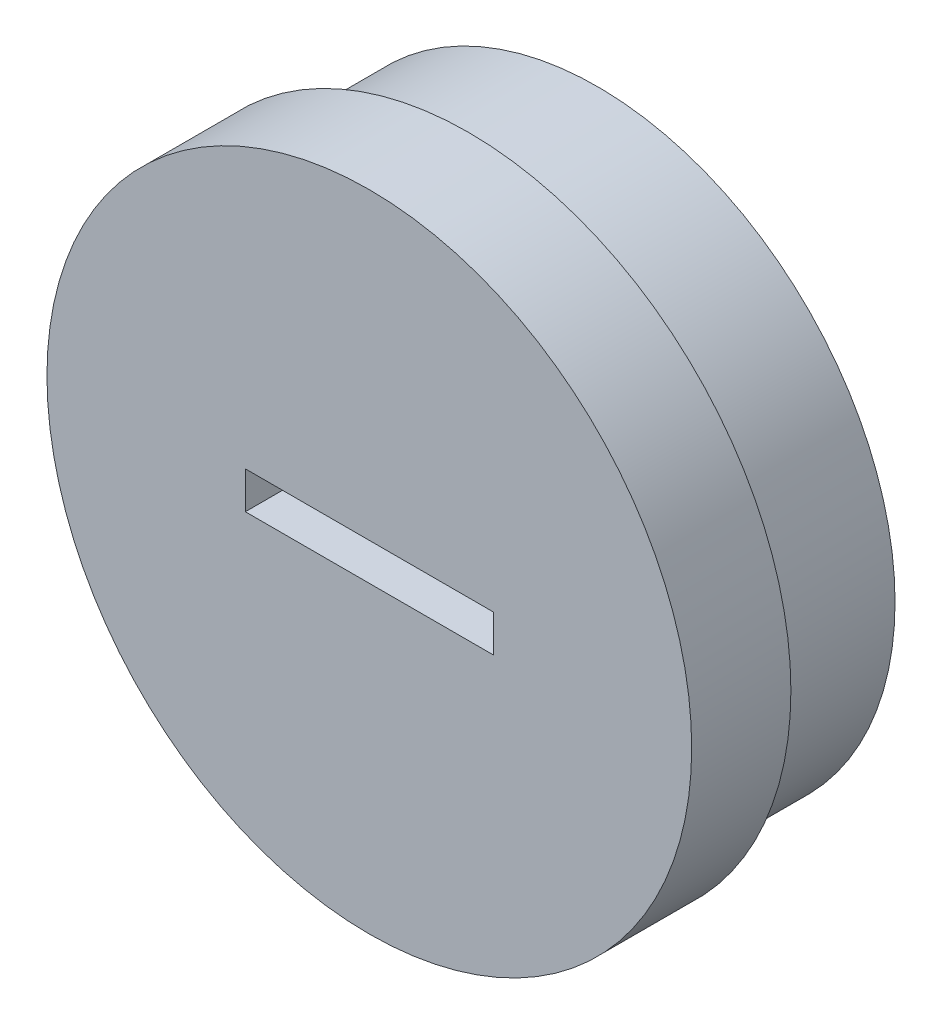
ISO-10303-21;
HEADER;
FILE_DESCRIPTION(('STEP AP214'),'2;1');
FILE_NAME('part.step','',(''),(''),'','','');
FILE_SCHEMA(('AUTOMOTIVE_DESIGN { 1 0 10303 214 1 1 1 1 }'));
ENDSEC;
DATA;
#1=APPLICATION_CONTEXT('core data for automotive mechanical design processes');
#2=APPLICATION_PROTOCOL_DEFINITION('international standard','automotive_design',2000,#1);
#3=PRODUCT_CONTEXT('',#1,'mechanical');
#4=PRODUCT('Part','Part','',(#3));
#5=PRODUCT_RELATED_PRODUCT_CATEGORY('part','',(#4));
#6=PRODUCT_DEFINITION_FORMATION('','',#4);
#7=PRODUCT_DEFINITION_CONTEXT('part definition',#1,'design');
#8=PRODUCT_DEFINITION('design','',#6,#7);
#9=PRODUCT_DEFINITION_SHAPE('','',#8);
#10=(LENGTH_UNIT() NAMED_UNIT(*) SI_UNIT(.MILLI.,.METRE.));
#11=(NAMED_UNIT(*) PLANE_ANGLE_UNIT() SI_UNIT($,.RADIAN.));
#12=(NAMED_UNIT(*) SI_UNIT($,.STERADIAN.) SOLID_ANGLE_UNIT());
#13=UNCERTAINTY_MEASURE_WITH_UNIT(LENGTH_MEASURE(1.E-05),#10,'distance_accuracy_value','');
#14=(GEOMETRIC_REPRESENTATION_CONTEXT(3) GLOBAL_UNCERTAINTY_ASSIGNED_CONTEXT((#13)) GLOBAL_UNIT_ASSIGNED_CONTEXT((#10,
#11,#12)) REPRESENTATION_CONTEXT('',''));
#15=CARTESIAN_POINT('',(0.,0.,0.));
#16=DIRECTION('',(0.,0.,1.));
#17=DIRECTION('',(1.,0.,0.));
#18=AXIS2_PLACEMENT_3D('',#15,#16,#17);
#19=CARTESIAN_POINT('',(0.,0.,4.));
#20=DIRECTION('',(0.,0.,-1.));
#21=DIRECTION('',(-1.,0.,0.));
#22=AXIS2_PLACEMENT_3D('',#19,#20,#21);
#23=CYLINDRICAL_SURFACE('',#22,13.);
#24=CARTESIAN_POINT('',(0.,0.,4.));
#25=DIRECTION('',(0.,0.,1.));
#26=DIRECTION('',(1.,0.,0.));
#27=AXIS2_PLACEMENT_3D('',#24,#25,#26);
#28=CIRCLE('',#27,13.);
#29=CARTESIAN_POINT('',(13.,0.,4.));
#30=VERTEX_POINT('',#29);
#31=EDGE_CURVE('E40',#30,#30,#28,.T.);
#32=ORIENTED_EDGE('',*,*,#31,.F.);
#33=EDGE_LOOP('',(#32));
#34=FACE_BOUND('',#33,.T.);
#35=CARTESIAN_POINT('',(0.,0.,0.));
#36=DIRECTION('',(0.,0.,1.));
#37=DIRECTION('',(1.,0.,0.));
#38=AXIS2_PLACEMENT_3D('',#35,#36,#37);
#39=CIRCLE('',#38,13.);
#40=CARTESIAN_POINT('',(13.,0.,0.));
#41=VERTEX_POINT('',#40);
#42=EDGE_CURVE('E117',#41,#41,#39,.T.);
#43=ORIENTED_EDGE('',*,*,#42,.T.);
#44=EDGE_LOOP('',(#43));
#45=FACE_BOUND('',#44,.T.);
#46=ADVANCED_FACE('F33',(#34,#45),#23,.T.);
#47=CARTESIAN_POINT('',(0.,0.,4.));
#48=DIRECTION('',(0.,0.,1.));
#49=DIRECTION('',(1.,0.,0.));
#50=AXIS2_PLACEMENT_3D('',#47,#48,#49);
#51=PLANE('',#50);
#52=DIRECTION('',(0.,1.,0.));
#53=VECTOR('',#52,1.);
#54=CARTESIAN_POINT('',(5.,0.75,4.));
#55=LINE('',#54,#53);
#56=CARTESIAN_POINT('',(5.,-0.75,4.));
#57=VERTEX_POINT('',#56);
#58=CARTESIAN_POINT('',(5.,0.75,4.));
#59=VERTEX_POINT('',#58);
#60=EDGE_CURVE('E47',#57,#59,#55,.T.);
#61=ORIENTED_EDGE('',*,*,#60,.F.);
#62=DIRECTION('',(1.,0.,0.));
#63=VECTOR('',#62,1.);
#64=CARTESIAN_POINT('',(-5.,-0.75,4.));
#65=LINE('',#64,#63);
#66=CARTESIAN_POINT('',(-5.,-0.75,4.));
#67=VERTEX_POINT('',#66);
#68=EDGE_CURVE('E98',#67,#57,#65,.T.);
#69=ORIENTED_EDGE('',*,*,#68,.F.);
#70=DIRECTION('',(0.,-1.,0.));
#71=VECTOR('',#70,1.);
#72=CARTESIAN_POINT('',(-5.,0.75,4.));
#73=LINE('',#72,#71);
#74=CARTESIAN_POINT('',(-5.,0.75,4.));
#75=VERTEX_POINT('',#74);
#76=EDGE_CURVE('E104',#75,#67,#73,.T.);
#77=ORIENTED_EDGE('',*,*,#76,.F.);
#78=DIRECTION('',(-1.,0.,0.));
#79=VECTOR('',#78,1.);
#80=CARTESIAN_POINT('',(-5.,0.75,4.));
#81=LINE('',#80,#79);
#82=EDGE_CURVE('E82',#59,#75,#81,.T.);
#83=ORIENTED_EDGE('',*,*,#82,.F.);
#84=EDGE_LOOP('',(#61,#69,#77,#83));
#85=FACE_BOUND('',#84,.T.);
#86=ORIENTED_EDGE('',*,*,#31,.T.);
#87=EDGE_LOOP('',(#86));
#88=FACE_BOUND('',#87,.T.);
#89=ADVANCED_FACE('F128',(#85,#88),#51,.T.);
#90=CARTESIAN_POINT('',(0.,0.,0.));
#91=DIRECTION('',(0.,0.,1.));
#92=DIRECTION('',(1.,0.,0.));
#93=AXIS2_PLACEMENT_3D('',#90,#91,#92);
#94=PLANE('',#93);
#95=CARTESIAN_POINT('',(0.,0.,0.));
#96=DIRECTION('',(0.,0.,1.));
#97=DIRECTION('',(1.,0.,0.));
#98=AXIS2_PLACEMENT_3D('',#95,#96,#97);
#99=CIRCLE('',#98,12.);
#100=CARTESIAN_POINT('',(12.,0.,0.));
#101=VERTEX_POINT('',#100);
#102=EDGE_CURVE('E113',#101,#101,#99,.T.);
#103=ORIENTED_EDGE('',*,*,#102,.T.);
#104=EDGE_LOOP('',(#103));
#105=FACE_BOUND('',#104,.T.);
#106=ORIENTED_EDGE('',*,*,#42,.F.);
#107=EDGE_LOOP('',(#106));
#108=FACE_BOUND('',#107,.T.);
#109=ADVANCED_FACE('F125',(#105,#108),#94,.F.);
#110=CARTESIAN_POINT('',(0.,0.,-5.2));
#111=DIRECTION('',(0.,0.,1.));
#112=DIRECTION('',(1.,0.,0.));
#113=AXIS2_PLACEMENT_3D('',#110,#111,#112);
#114=CYLINDRICAL_SURFACE('',#113,12.);
#115=CARTESIAN_POINT('',(0.,0.,-5.2));
#116=DIRECTION('',(0.,0.,1.));
#117=DIRECTION('',(1.,0.,0.));
#118=AXIS2_PLACEMENT_3D('',#115,#116,#117);
#119=CIRCLE('',#118,12.);
#120=CARTESIAN_POINT('',(12.,0.,-5.2));
#121=VERTEX_POINT('',#120);
#122=EDGE_CURVE('E114',#121,#121,#119,.T.);
#123=ORIENTED_EDGE('',*,*,#122,.T.);
#124=EDGE_LOOP('',(#123));
#125=FACE_BOUND('',#124,.T.);
#126=ORIENTED_EDGE('',*,*,#102,.F.);
#127=EDGE_LOOP('',(#126));
#128=FACE_BOUND('',#127,.T.);
#129=ADVANCED_FACE('F127',(#125,#128),#114,.T.);
#130=CARTESIAN_POINT('',(0.,0.,-5.2));
#131=DIRECTION('',(0.,0.,1.));
#132=DIRECTION('',(1.,0.,0.));
#133=AXIS2_PLACEMENT_3D('',#130,#131,#132);
#134=PLANE('',#133);
#135=CARTESIAN_POINT('',(0.,0.,-5.2));
#136=DIRECTION('',(0.,0.,1.));
#137=DIRECTION('',(1.,0.,0.));
#138=AXIS2_PLACEMENT_3D('',#135,#136,#137);
#139=CIRCLE('',#138,10.075);
#140=CARTESIAN_POINT('',(10.075,0.,-5.2));
#141=VERTEX_POINT('',#140);
#142=EDGE_CURVE('E108',#141,#141,#139,.T.);
#143=ORIENTED_EDGE('',*,*,#142,.T.);
#144=EDGE_LOOP('',(#143));
#145=FACE_BOUND('',#144,.T.);
#146=ORIENTED_EDGE('',*,*,#122,.F.);
#147=EDGE_LOOP('',(#146));
#148=FACE_BOUND('',#147,.T.);
#149=ADVANCED_FACE('F135',(#145,#148),#134,.F.);
#150=CARTESIAN_POINT('',(0.,0.,-5.2));
#151=DIRECTION('',(0.,0.,1.));
#152=DIRECTION('',(1.,0.,0.));
#153=AXIS2_PLACEMENT_3D('',#150,#151,#152);
#154=CYLINDRICAL_SURFACE('',#153,10.075);
#155=ORIENTED_EDGE('',*,*,#142,.F.);
#156=EDGE_LOOP('',(#155));
#157=FACE_BOUND('',#156,.T.);
#158=CARTESIAN_POINT('',(0.,0.,0.));
#159=DIRECTION('',(0.,0.,1.));
#160=DIRECTION('',(1.,0.,0.));
#161=AXIS2_PLACEMENT_3D('',#158,#159,#160);
#162=CIRCLE('',#161,10.075);
#163=CARTESIAN_POINT('',(10.075,0.,0.));
#164=VERTEX_POINT('',#163);
#165=EDGE_CURVE('E11',#164,#164,#162,.T.);
#166=ORIENTED_EDGE('',*,*,#165,.T.);
#167=EDGE_LOOP('',(#166));
#168=FACE_BOUND('',#167,.T.);
#169=ADVANCED_FACE('F142',(#157,#168),#154,.F.);
#170=ORIENTED_EDGE('',*,*,#165,.F.);
#171=EDGE_LOOP('',(#170));
#172=FACE_BOUND('',#171,.T.);
#173=ADVANCED_FACE('F130',(#172),#94,.F.);
#174=CARTESIAN_POINT('',(5.,0.75,1.5));
#175=DIRECTION('',(1.,0.,0.));
#176=DIRECTION('',(0.,0.,-1.));
#177=AXIS2_PLACEMENT_3D('',#174,#175,#176);
#178=PLANE('',#177);
#179=ORIENTED_EDGE('',*,*,#60,.T.);
#180=DIRECTION('',(0.,0.,1.));
#181=VECTOR('',#180,1.);
#182=CARTESIAN_POINT('',(5.,0.75,1.5));
#183=LINE('',#182,#181);
#184=CARTESIAN_POINT('',(5.,0.75,1.5));
#185=VERTEX_POINT('',#184);
#186=EDGE_CURVE('E70',#185,#59,#183,.T.);
#187=ORIENTED_EDGE('',*,*,#186,.F.);
#188=DIRECTION('',(0.,1.,0.));
#189=VECTOR('',#188,1.);
#190=CARTESIAN_POINT('',(5.,0.75,1.5));
#191=LINE('',#190,#189);
#192=CARTESIAN_POINT('',(5.,-0.75,1.5));
#193=VERTEX_POINT('',#192);
#194=EDGE_CURVE('E96',#193,#185,#191,.T.);
#195=ORIENTED_EDGE('',*,*,#194,.F.);
#196=DIRECTION('',(0.,0.,1.));
#197=VECTOR('',#196,1.);
#198=CARTESIAN_POINT('',(5.,-0.75,1.5));
#199=LINE('',#198,#197);
#200=EDGE_CURVE('E55',#193,#57,#199,.T.);
#201=ORIENTED_EDGE('',*,*,#200,.T.);
#202=EDGE_LOOP('',(#179,#187,#195,#201));
#203=FACE_BOUND('',#202,.T.);
#204=ADVANCED_FACE('F141',(#203),#178,.F.);
#205=CARTESIAN_POINT('',(-5.,-0.75,1.5));
#206=DIRECTION('',(0.,-1.,0.));
#207=DIRECTION('',(0.,0.,-1.));
#208=AXIS2_PLACEMENT_3D('',#205,#206,#207);
#209=PLANE('',#208);
#210=ORIENTED_EDGE('',*,*,#68,.T.);
#211=ORIENTED_EDGE('',*,*,#200,.F.);
#212=DIRECTION('',(1.,0.,0.));
#213=VECTOR('',#212,1.);
#214=CARTESIAN_POINT('',(-5.,-0.75,1.5));
#215=LINE('',#214,#213);
#216=CARTESIAN_POINT('',(-5.,-0.75,1.5));
#217=VERTEX_POINT('',#216);
#218=EDGE_CURVE('E93',#217,#193,#215,.T.);
#219=ORIENTED_EDGE('',*,*,#218,.F.);
#220=DIRECTION('',(0.,0.,1.));
#221=VECTOR('',#220,1.);
#222=CARTESIAN_POINT('',(-5.,-0.75,1.5));
#223=LINE('',#222,#221);
#224=EDGE_CURVE('E86',#217,#67,#223,.T.);
#225=ORIENTED_EDGE('',*,*,#224,.T.);
#226=EDGE_LOOP('',(#210,#211,#219,#225));
#227=FACE_BOUND('',#226,.T.);
#228=ADVANCED_FACE('F168',(#227),#209,.F.);
#229=CARTESIAN_POINT('',(-5.,0.75,1.5));
#230=DIRECTION('',(-1.,0.,0.));
#231=DIRECTION('',(0.,0.,1.));
#232=AXIS2_PLACEMENT_3D('',#229,#230,#231);
#233=PLANE('',#232);
#234=ORIENTED_EDGE('',*,*,#76,.T.);
#235=ORIENTED_EDGE('',*,*,#224,.F.);
#236=DIRECTION('',(0.,-1.,0.));
#237=VECTOR('',#236,1.);
#238=CARTESIAN_POINT('',(-5.,0.75,1.5));
#239=LINE('',#238,#237);
#240=CARTESIAN_POINT('',(-5.,0.75,1.5));
#241=VERTEX_POINT('',#240);
#242=EDGE_CURVE('E89',#241,#217,#239,.T.);
#243=ORIENTED_EDGE('',*,*,#242,.F.);
#244=DIRECTION('',(0.,0.,1.));
#245=VECTOR('',#244,1.);
#246=CARTESIAN_POINT('',(-5.,0.75,1.5));
#247=LINE('',#246,#245);
#248=EDGE_CURVE('E75',#241,#75,#247,.T.);
#249=ORIENTED_EDGE('',*,*,#248,.T.);
#250=EDGE_LOOP('',(#234,#235,#243,#249));
#251=FACE_BOUND('',#250,.T.);
#252=ADVANCED_FACE('F90',(#251),#233,.F.);
#253=CARTESIAN_POINT('',(-5.,0.75,1.5));
#254=DIRECTION('',(0.,1.,0.));
#255=DIRECTION('',(0.,0.,1.));
#256=AXIS2_PLACEMENT_3D('',#253,#254,#255);
#257=PLANE('',#256);
#258=ORIENTED_EDGE('',*,*,#82,.T.);
#259=ORIENTED_EDGE('',*,*,#248,.F.);
#260=DIRECTION('',(-1.,0.,0.));
#261=VECTOR('',#260,1.);
#262=CARTESIAN_POINT('',(-5.,0.75,1.5));
#263=LINE('',#262,#261);
#264=EDGE_CURVE('E79',#185,#241,#263,.T.);
#265=ORIENTED_EDGE('',*,*,#264,.F.);
#266=ORIENTED_EDGE('',*,*,#186,.T.);
#267=EDGE_LOOP('',(#258,#259,#265,#266));
#268=FACE_BOUND('',#267,.T.);
#269=ADVANCED_FACE('F77',(#268),#257,.F.);
#270=CARTESIAN_POINT('',(0.,0.,1.5));
#271=DIRECTION('',(0.,0.,1.));
#272=DIRECTION('',(1.,0.,0.));
#273=AXIS2_PLACEMENT_3D('',#270,#271,#272);
#274=PLANE('',#273);
#275=ORIENTED_EDGE('',*,*,#194,.T.);
#276=ORIENTED_EDGE('',*,*,#264,.T.);
#277=ORIENTED_EDGE('',*,*,#242,.T.);
#278=ORIENTED_EDGE('',*,*,#218,.T.);
#279=EDGE_LOOP('',(#275,#276,#277,#278));
#280=FACE_BOUND('',#279,.T.);
#281=ADVANCED_FACE('F95',(#280),#274,.T.);
#282=CLOSED_SHELL('',(#46,#89,#109,#129,#149,#169,#173,#204,#228,#252,#269,#281));
#283=MANIFOLD_SOLID_BREP('B2',#282);
#284=ADVANCED_BREP_SHAPE_REPRESENTATION('',(#18,#283),#14);
#285=SHAPE_DEFINITION_REPRESENTATION(#9,#284);
ENDSEC;
END-ISO-10303-21;
